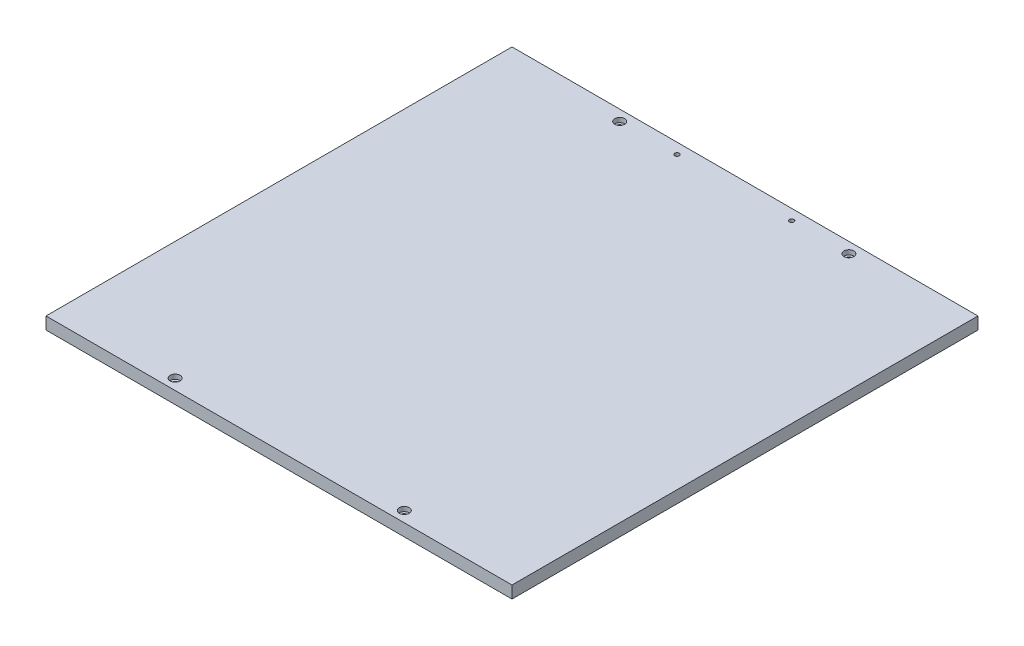
ISO-10303-21;
HEADER;
FILE_DESCRIPTION(('STEP AP214'),'2;1');
FILE_NAME('part.step','',(''),(''),'','','');
FILE_SCHEMA(('AUTOMOTIVE_DESIGN { 1 0 10303 214 1 1 1 1 }'));
ENDSEC;
DATA;
#1=APPLICATION_CONTEXT('core data for automotive mechanical design processes');
#2=APPLICATION_PROTOCOL_DEFINITION('international standard','automotive_design',2000,#1);
#3=PRODUCT_CONTEXT('',#1,'mechanical');
#4=PRODUCT('Part','Part','',(#3));
#5=PRODUCT_RELATED_PRODUCT_CATEGORY('part','',(#4));
#6=PRODUCT_DEFINITION_FORMATION('','',#4);
#7=PRODUCT_DEFINITION_CONTEXT('part definition',#1,'design');
#8=PRODUCT_DEFINITION('design','',#6,#7);
#9=PRODUCT_DEFINITION_SHAPE('','',#8);
#10=(LENGTH_UNIT() NAMED_UNIT(*) SI_UNIT(.MILLI.,.METRE.));
#11=(NAMED_UNIT(*) PLANE_ANGLE_UNIT() SI_UNIT($,.RADIAN.));
#12=(NAMED_UNIT(*) SI_UNIT($,.STERADIAN.) SOLID_ANGLE_UNIT());
#13=UNCERTAINTY_MEASURE_WITH_UNIT(LENGTH_MEASURE(1.E-05),#10,'distance_accuracy_value','');
#14=(GEOMETRIC_REPRESENTATION_CONTEXT(3) GLOBAL_UNCERTAINTY_ASSIGNED_CONTEXT((#13)) GLOBAL_UNIT_ASSIGNED_CONTEXT((#10,
#11,#12)) REPRESENTATION_CONTEXT('',''));
#15=CARTESIAN_POINT('',(0.,0.,0.));
#16=DIRECTION('',(0.,0.,1.));
#17=DIRECTION('',(1.,0.,0.));
#18=AXIS2_PLACEMENT_3D('',#15,#16,#17);
#19=CARTESIAN_POINT('',(152.5,8.,152.5));
#20=DIRECTION('',(-1.,0.,0.));
#21=DIRECTION('',(0.,0.,1.));
#22=AXIS2_PLACEMENT_3D('',#19,#20,#21);
#23=PLANE('',#22);
#24=DIRECTION('',(0.,0.,-1.));
#25=VECTOR('',#24,1.);
#26=CARTESIAN_POINT('',(152.5,0.,152.5));
#27=LINE('',#26,#25);
#28=CARTESIAN_POINT('',(152.5,0.,152.5));
#29=VERTEX_POINT('',#28);
#30=CARTESIAN_POINT('',(152.5,0.,-152.5));
#31=VERTEX_POINT('',#30);
#32=EDGE_CURVE('E111',#29,#31,#27,.T.);
#33=ORIENTED_EDGE('',*,*,#32,.T.);
#34=DIRECTION('',(0.,-1.,0.));
#35=VECTOR('',#34,1.);
#36=CARTESIAN_POINT('',(152.5,8.,-152.5));
#37=LINE('',#36,#35);
#38=CARTESIAN_POINT('',(152.5,8.,-152.5));
#39=VERTEX_POINT('',#38);
#40=EDGE_CURVE('E11',#39,#31,#37,.T.);
#41=ORIENTED_EDGE('',*,*,#40,.F.);
#42=DIRECTION('',(0.,0.,-1.));
#43=VECTOR('',#42,1.);
#44=CARTESIAN_POINT('',(152.5,8.,152.5));
#45=LINE('',#44,#43);
#46=CARTESIAN_POINT('',(152.5,8.,152.5));
#47=VERTEX_POINT('',#46);
#48=EDGE_CURVE('E95',#47,#39,#45,.T.);
#49=ORIENTED_EDGE('',*,*,#48,.F.);
#50=DIRECTION('',(0.,-1.,0.));
#51=VECTOR('',#50,1.);
#52=CARTESIAN_POINT('',(152.5,8.,152.5));
#53=LINE('',#52,#51);
#54=EDGE_CURVE('E107',#47,#29,#53,.T.);
#55=ORIENTED_EDGE('',*,*,#54,.T.);
#56=EDGE_LOOP('',(#33,#41,#49,#55));
#57=FACE_BOUND('',#56,.T.);
#58=ADVANCED_FACE('F43',(#57),#23,.F.);
#59=CARTESIAN_POINT('',(-152.5,8.,-152.5));
#60=DIRECTION('',(0.,0.,1.));
#61=DIRECTION('',(1.,0.,0.));
#62=AXIS2_PLACEMENT_3D('',#59,#60,#61);
#63=PLANE('',#62);
#64=DIRECTION('',(-1.,0.,0.));
#65=VECTOR('',#64,1.);
#66=CARTESIAN_POINT('',(-152.5,0.,-152.5));
#67=LINE('',#66,#65);
#68=CARTESIAN_POINT('',(-152.5,0.,-152.5));
#69=VERTEX_POINT('',#68);
#70=EDGE_CURVE('E100',#31,#69,#67,.T.);
#71=ORIENTED_EDGE('',*,*,#70,.T.);
#72=DIRECTION('',(0.,-1.,0.));
#73=VECTOR('',#72,1.);
#74=CARTESIAN_POINT('',(-152.5,8.,-152.5));
#75=LINE('',#74,#73);
#76=CARTESIAN_POINT('',(-152.5,8.,-152.5));
#77=VERTEX_POINT('',#76);
#78=EDGE_CURVE('E52',#77,#69,#75,.T.);
#79=ORIENTED_EDGE('',*,*,#78,.F.);
#80=DIRECTION('',(-1.,0.,0.));
#81=VECTOR('',#80,1.);
#82=CARTESIAN_POINT('',(-152.5,8.,-152.5));
#83=LINE('',#82,#81);
#84=EDGE_CURVE('E90',#39,#77,#83,.T.);
#85=ORIENTED_EDGE('',*,*,#84,.F.);
#86=ORIENTED_EDGE('',*,*,#40,.T.);
#87=EDGE_LOOP('',(#71,#79,#85,#86));
#88=FACE_BOUND('',#87,.T.);
#89=ADVANCED_FACE('F99',(#88),#63,.F.);
#90=CARTESIAN_POINT('',(-152.5,8.,152.5));
#91=DIRECTION('',(1.,0.,0.));
#92=DIRECTION('',(0.,0.,-1.));
#93=AXIS2_PLACEMENT_3D('',#90,#91,#92);
#94=PLANE('',#93);
#95=DIRECTION('',(0.,0.,1.));
#96=VECTOR('',#95,1.);
#97=CARTESIAN_POINT('',(-152.5,0.,152.5));
#98=LINE('',#97,#96);
#99=CARTESIAN_POINT('',(-152.5,0.,152.5));
#100=VERTEX_POINT('',#99);
#101=EDGE_CURVE('E77',#69,#100,#98,.T.);
#102=ORIENTED_EDGE('',*,*,#101,.T.);
#103=DIRECTION('',(0.,-1.,0.));
#104=VECTOR('',#103,1.);
#105=CARTESIAN_POINT('',(-152.5,8.,152.5));
#106=LINE('',#105,#104);
#107=CARTESIAN_POINT('',(-152.5,8.,152.5));
#108=VERTEX_POINT('',#107);
#109=EDGE_CURVE('E102',#108,#100,#106,.T.);
#110=ORIENTED_EDGE('',*,*,#109,.F.);
#111=DIRECTION('',(0.,0.,1.));
#112=VECTOR('',#111,1.);
#113=CARTESIAN_POINT('',(-152.5,8.,152.5));
#114=LINE('',#113,#112);
#115=EDGE_CURVE('E93',#77,#108,#114,.T.);
#116=ORIENTED_EDGE('',*,*,#115,.F.);
#117=ORIENTED_EDGE('',*,*,#78,.T.);
#118=EDGE_LOOP('',(#102,#110,#116,#117));
#119=FACE_BOUND('',#118,.T.);
#120=ADVANCED_FACE('F103',(#119),#94,.F.);
#121=CARTESIAN_POINT('',(-152.5,8.,152.5));
#122=DIRECTION('',(0.,0.,-1.));
#123=DIRECTION('',(-1.,0.,0.));
#124=AXIS2_PLACEMENT_3D('',#121,#122,#123);
#125=PLANE('',#124);
#126=DIRECTION('',(1.,0.,0.));
#127=VECTOR('',#126,1.);
#128=CARTESIAN_POINT('',(-152.5,0.,152.5));
#129=LINE('',#128,#127);
#130=EDGE_CURVE('E83',#100,#29,#129,.T.);
#131=ORIENTED_EDGE('',*,*,#130,.T.);
#132=ORIENTED_EDGE('',*,*,#54,.F.);
#133=DIRECTION('',(1.,0.,0.));
#134=VECTOR('',#133,1.);
#135=CARTESIAN_POINT('',(-152.5,8.,152.5));
#136=LINE('',#135,#134);
#137=EDGE_CURVE('E60',#108,#47,#136,.T.);
#138=ORIENTED_EDGE('',*,*,#137,.F.);
#139=ORIENTED_EDGE('',*,*,#109,.T.);
#140=EDGE_LOOP('',(#131,#132,#138,#139));
#141=FACE_BOUND('',#140,.T.);
#142=ADVANCED_FACE('F125',(#141),#125,.F.);
#143=CARTESIAN_POINT('',(0.,8.,0.));
#144=DIRECTION('',(0.,-1.,0.));
#145=DIRECTION('',(0.,0.,-1.));
#146=AXIS2_PLACEMENT_3D('',#143,#144,#145);
#147=PLANE('',#146);
#148=CARTESIAN_POINT('',(-37.5,8.,-145.5));
#149=DIRECTION('',(0.,1.,0.));
#150=DIRECTION('',(0.,0.,1.));
#151=AXIS2_PLACEMENT_3D('',#148,#149,#150);
#152=CIRCLE('',#151,1.5);
#153=CARTESIAN_POINT('',(-37.5,8.,-144.));
#154=VERTEX_POINT('',#153);
#155=EDGE_CURVE('E207',#154,#154,#152,.T.);
#156=ORIENTED_EDGE('',*,*,#155,.F.);
#157=EDGE_LOOP('',(#156));
#158=FACE_BOUND('',#157,.T.);
#159=CARTESIAN_POINT('',(37.5,8.,-145.5));
#160=DIRECTION('',(0.,1.,0.));
#161=DIRECTION('',(0.,0.,1.));
#162=AXIS2_PLACEMENT_3D('',#159,#160,#161);
#163=CIRCLE('',#162,1.5);
#164=CARTESIAN_POINT('',(37.5,8.,-144.));
#165=VERTEX_POINT('',#164);
#166=EDGE_CURVE('E199',#165,#165,#163,.T.);
#167=ORIENTED_EDGE('',*,*,#166,.F.);
#168=EDGE_LOOP('',(#167));
#169=FACE_BOUND('',#168,.T.);
#170=CARTESIAN_POINT('',(-75.,8.,-145.5));
#171=DIRECTION('',(0.,1.,0.));
#172=DIRECTION('',(0.,0.,1.));
#173=AXIS2_PLACEMENT_3D('',#170,#171,#172);
#174=CIRCLE('',#173,3.25);
#175=CARTESIAN_POINT('',(-75.,8.,-142.25));
#176=VERTEX_POINT('',#175);
#177=EDGE_CURVE('E191',#176,#176,#174,.T.);
#178=ORIENTED_EDGE('',*,*,#177,.F.);
#179=EDGE_LOOP('',(#178));
#180=FACE_BOUND('',#179,.T.);
#181=CARTESIAN_POINT('',(75.,8.,-145.5));
#182=DIRECTION('',(0.,1.,0.));
#183=DIRECTION('',(0.,0.,1.));
#184=AXIS2_PLACEMENT_3D('',#181,#182,#183);
#185=CIRCLE('',#184,3.25);
#186=CARTESIAN_POINT('',(75.,8.,-142.25));
#187=VERTEX_POINT('',#186);
#188=EDGE_CURVE('E175',#187,#187,#185,.T.);
#189=ORIENTED_EDGE('',*,*,#188,.F.);
#190=EDGE_LOOP('',(#189));
#191=FACE_BOUND('',#190,.T.);
#192=CARTESIAN_POINT('',(75.,8.,145.5));
#193=DIRECTION('',(0.,1.,0.));
#194=DIRECTION('',(0.,0.,1.));
#195=AXIS2_PLACEMENT_3D('',#192,#193,#194);
#196=CIRCLE('',#195,3.25);
#197=CARTESIAN_POINT('',(75.,8.,148.75));
#198=VERTEX_POINT('',#197);
#199=EDGE_CURVE('E159',#198,#198,#196,.T.);
#200=ORIENTED_EDGE('',*,*,#199,.F.);
#201=EDGE_LOOP('',(#200));
#202=FACE_BOUND('',#201,.T.);
#203=CARTESIAN_POINT('',(-75.,8.,145.5));
#204=DIRECTION('',(0.,1.,0.));
#205=DIRECTION('',(0.,0.,1.));
#206=AXIS2_PLACEMENT_3D('',#203,#204,#205);
#207=CIRCLE('',#206,3.25);
#208=CARTESIAN_POINT('',(-75.,8.,148.75));
#209=VERTEX_POINT('',#208);
#210=EDGE_CURVE('E143',#209,#209,#207,.T.);
#211=ORIENTED_EDGE('',*,*,#210,.F.);
#212=EDGE_LOOP('',(#211));
#213=FACE_BOUND('',#212,.T.);
#214=ORIENTED_EDGE('',*,*,#48,.T.);
#215=ORIENTED_EDGE('',*,*,#84,.T.);
#216=ORIENTED_EDGE('',*,*,#115,.T.);
#217=ORIENTED_EDGE('',*,*,#137,.T.);
#218=EDGE_LOOP('',(#214,#215,#216,#217));
#219=FACE_BOUND('',#218,.T.);
#220=ADVANCED_FACE('F91',(#158,#169,#180,#191,#202,#213,#219),#147,.F.);
#221=CARTESIAN_POINT('',(0.,0.,0.));
#222=DIRECTION('',(0.,-1.,0.));
#223=DIRECTION('',(0.,0.,-1.));
#224=AXIS2_PLACEMENT_3D('',#221,#222,#223);
#225=PLANE('',#224);
#226=CARTESIAN_POINT('',(-37.5,0.,-145.5));
#227=DIRECTION('',(0.,1.,0.));
#228=DIRECTION('',(0.,0.,1.));
#229=AXIS2_PLACEMENT_3D('',#226,#227,#228);
#230=CIRCLE('',#229,1.5);
#231=CARTESIAN_POINT('',(-37.5,0.,-144.));
#232=VERTEX_POINT('',#231);
#233=EDGE_CURVE('E203',#232,#232,#230,.T.);
#234=ORIENTED_EDGE('',*,*,#233,.T.);
#235=EDGE_LOOP('',(#234));
#236=FACE_BOUND('',#235,.T.);
#237=CARTESIAN_POINT('',(37.5,0.,-145.5));
#238=DIRECTION('',(0.,1.,0.));
#239=DIRECTION('',(0.,0.,1.));
#240=AXIS2_PLACEMENT_3D('',#237,#238,#239);
#241=CIRCLE('',#240,1.5);
#242=CARTESIAN_POINT('',(37.5,0.,-144.));
#243=VERTEX_POINT('',#242);
#244=EDGE_CURVE('E195',#243,#243,#241,.T.);
#245=ORIENTED_EDGE('',*,*,#244,.T.);
#246=EDGE_LOOP('',(#245));
#247=FACE_BOUND('',#246,.T.);
#248=CARTESIAN_POINT('',(-75.,0.,-145.5));
#249=DIRECTION('',(0.,1.,0.));
#250=DIRECTION('',(0.,0.,1.));
#251=AXIS2_PLACEMENT_3D('',#248,#249,#250);
#252=CIRCLE('',#251,1.69999999999999);
#253=CARTESIAN_POINT('',(-75.,0.,-143.8));
#254=VERTEX_POINT('',#253);
#255=EDGE_CURVE('E179',#254,#254,#252,.T.);
#256=ORIENTED_EDGE('',*,*,#255,.T.);
#257=EDGE_LOOP('',(#256));
#258=FACE_BOUND('',#257,.T.);
#259=CARTESIAN_POINT('',(75.,0.,-145.5));
#260=DIRECTION('',(0.,1.,0.));
#261=DIRECTION('',(0.,0.,1.));
#262=AXIS2_PLACEMENT_3D('',#259,#260,#261);
#263=CIRCLE('',#262,1.69999999999999);
#264=CARTESIAN_POINT('',(75.,0.,-143.8));
#265=VERTEX_POINT('',#264);
#266=EDGE_CURVE('E163',#265,#265,#263,.T.);
#267=ORIENTED_EDGE('',*,*,#266,.T.);
#268=EDGE_LOOP('',(#267));
#269=FACE_BOUND('',#268,.T.);
#270=CARTESIAN_POINT('',(75.,0.,145.5));
#271=DIRECTION('',(0.,1.,0.));
#272=DIRECTION('',(0.,0.,1.));
#273=AXIS2_PLACEMENT_3D('',#270,#271,#272);
#274=CIRCLE('',#273,1.69999999999999);
#275=CARTESIAN_POINT('',(75.,0.,147.2));
#276=VERTEX_POINT('',#275);
#277=EDGE_CURVE('E147',#276,#276,#274,.T.);
#278=ORIENTED_EDGE('',*,*,#277,.T.);
#279=EDGE_LOOP('',(#278));
#280=FACE_BOUND('',#279,.T.);
#281=CARTESIAN_POINT('',(-75.,0.,145.5));
#282=DIRECTION('',(0.,1.,0.));
#283=DIRECTION('',(0.,0.,1.));
#284=AXIS2_PLACEMENT_3D('',#281,#282,#283);
#285=CIRCLE('',#284,1.69999999999999);
#286=CARTESIAN_POINT('',(-75.,0.,147.2));
#287=VERTEX_POINT('',#286);
#288=EDGE_CURVE('E115',#287,#287,#285,.T.);
#289=ORIENTED_EDGE('',*,*,#288,.T.);
#290=EDGE_LOOP('',(#289));
#291=FACE_BOUND('',#290,.T.);
#292=ORIENTED_EDGE('',*,*,#32,.F.);
#293=ORIENTED_EDGE('',*,*,#130,.F.);
#294=ORIENTED_EDGE('',*,*,#101,.F.);
#295=ORIENTED_EDGE('',*,*,#70,.F.);
#296=EDGE_LOOP('',(#292,#293,#294,#295));
#297=FACE_BOUND('',#296,.T.);
#298=ADVANCED_FACE('F128',(#236,#247,#258,#269,#280,#291,#297),#225,.T.);
#299=CARTESIAN_POINT('',(-75.,8.,145.5));
#300=DIRECTION('',(0.,1.,0.));
#301=DIRECTION('',(0.,0.,1.));
#302=AXIS2_PLACEMENT_3D('',#299,#300,#301);
#303=CYLINDRICAL_SURFACE('',#302,1.69999999999999);
#304=ORIENTED_EDGE('',*,*,#288,.F.);
#305=EDGE_LOOP('',(#304));
#306=FACE_BOUND('',#305,.T.);
#307=CARTESIAN_POINT('',(-75.,5.,145.5));
#308=DIRECTION('',(0.,1.,0.));
#309=DIRECTION('',(0.,0.,1.));
#310=AXIS2_PLACEMENT_3D('',#307,#308,#309);
#311=CIRCLE('',#310,1.69999999999999);
#312=CARTESIAN_POINT('',(-75.,5.,147.2));
#313=VERTEX_POINT('',#312);
#314=EDGE_CURVE('E135',#313,#313,#311,.T.);
#315=ORIENTED_EDGE('',*,*,#314,.T.);
#316=EDGE_LOOP('',(#315));
#317=FACE_BOUND('',#316,.T.);
#318=ADVANCED_FACE('F240',(#306,#317),#303,.F.);
#319=CARTESIAN_POINT('',(-73.3,5.,145.5));
#320=DIRECTION('',(0.,-1.,0.));
#321=DIRECTION('',(0.,0.,-1.));
#322=AXIS2_PLACEMENT_3D('',#319,#320,#321);
#323=PLANE('',#322);
#324=ORIENTED_EDGE('',*,*,#314,.F.);
#325=EDGE_LOOP('',(#324));
#326=FACE_BOUND('',#325,.T.);
#327=CARTESIAN_POINT('',(-75.,5.,145.5));
#328=DIRECTION('',(0.,1.,0.));
#329=DIRECTION('',(0.,0.,1.));
#330=AXIS2_PLACEMENT_3D('',#327,#328,#329);
#331=CIRCLE('',#330,3.25);
#332=CARTESIAN_POINT('',(-75.,5.,148.75));
#333=VERTEX_POINT('',#332);
#334=EDGE_CURVE('E139',#333,#333,#331,.T.);
#335=ORIENTED_EDGE('',*,*,#334,.T.);
#336=EDGE_LOOP('',(#335));
#337=FACE_BOUND('',#336,.T.);
#338=ADVANCED_FACE('F230',(#326,#337),#323,.F.);
#339=CARTESIAN_POINT('',(-75.,8.,145.5));
#340=DIRECTION('',(0.,1.,0.));
#341=DIRECTION('',(0.,0.,1.));
#342=AXIS2_PLACEMENT_3D('',#339,#340,#341);
#343=CYLINDRICAL_SURFACE('',#342,3.25);
#344=ORIENTED_EDGE('',*,*,#334,.F.);
#345=EDGE_LOOP('',(#344));
#346=FACE_BOUND('',#345,.T.);
#347=ORIENTED_EDGE('',*,*,#210,.T.);
#348=EDGE_LOOP('',(#347));
#349=FACE_BOUND('',#348,.T.);
#350=ADVANCED_FACE('F227',(#346,#349),#343,.F.);
#351=CARTESIAN_POINT('',(75.,8.,145.5));
#352=DIRECTION('',(0.,1.,0.));
#353=DIRECTION('',(0.,0.,1.));
#354=AXIS2_PLACEMENT_3D('',#351,#352,#353);
#355=CYLINDRICAL_SURFACE('',#354,1.69999999999999);
#356=ORIENTED_EDGE('',*,*,#277,.F.);
#357=EDGE_LOOP('',(#356));
#358=FACE_BOUND('',#357,.T.);
#359=CARTESIAN_POINT('',(75.,5.,145.5));
#360=DIRECTION('',(0.,1.,0.));
#361=DIRECTION('',(0.,0.,1.));
#362=AXIS2_PLACEMENT_3D('',#359,#360,#361);
#363=CIRCLE('',#362,1.69999999999999);
#364=CARTESIAN_POINT('',(75.,5.,147.2));
#365=VERTEX_POINT('',#364);
#366=EDGE_CURVE('E151',#365,#365,#363,.T.);
#367=ORIENTED_EDGE('',*,*,#366,.T.);
#368=EDGE_LOOP('',(#367));
#369=FACE_BOUND('',#368,.T.);
#370=ADVANCED_FACE('F229',(#358,#369),#355,.F.);
#371=CARTESIAN_POINT('',(76.7,5.,145.5));
#372=DIRECTION('',(0.,-1.,0.));
#373=DIRECTION('',(0.,0.,-1.));
#374=AXIS2_PLACEMENT_3D('',#371,#372,#373);
#375=PLANE('',#374);
#376=ORIENTED_EDGE('',*,*,#366,.F.);
#377=EDGE_LOOP('',(#376));
#378=FACE_BOUND('',#377,.T.);
#379=CARTESIAN_POINT('',(75.,5.,145.5));
#380=DIRECTION('',(0.,1.,0.));
#381=DIRECTION('',(0.,0.,1.));
#382=AXIS2_PLACEMENT_3D('',#379,#380,#381);
#383=CIRCLE('',#382,3.25);
#384=CARTESIAN_POINT('',(75.,5.,148.75));
#385=VERTEX_POINT('',#384);
#386=EDGE_CURVE('E155',#385,#385,#383,.T.);
#387=ORIENTED_EDGE('',*,*,#386,.T.);
#388=EDGE_LOOP('',(#387));
#389=FACE_BOUND('',#388,.T.);
#390=ADVANCED_FACE('F237',(#378,#389),#375,.F.);
#391=CARTESIAN_POINT('',(75.,8.,145.5));
#392=DIRECTION('',(0.,1.,0.));
#393=DIRECTION('',(0.,0.,1.));
#394=AXIS2_PLACEMENT_3D('',#391,#392,#393);
#395=CYLINDRICAL_SURFACE('',#394,3.25);
#396=ORIENTED_EDGE('',*,*,#386,.F.);
#397=EDGE_LOOP('',(#396));
#398=FACE_BOUND('',#397,.T.);
#399=ORIENTED_EDGE('',*,*,#199,.T.);
#400=EDGE_LOOP('',(#399));
#401=FACE_BOUND('',#400,.T.);
#402=ADVANCED_FACE('F293',(#398,#401),#395,.F.);
#403=CARTESIAN_POINT('',(75.,8.,-145.5));
#404=DIRECTION('',(0.,1.,0.));
#405=DIRECTION('',(0.,0.,1.));
#406=AXIS2_PLACEMENT_3D('',#403,#404,#405);
#407=CYLINDRICAL_SURFACE('',#406,1.69999999999999);
#408=ORIENTED_EDGE('',*,*,#266,.F.);
#409=EDGE_LOOP('',(#408));
#410=FACE_BOUND('',#409,.T.);
#411=CARTESIAN_POINT('',(75.,5.,-145.5));
#412=DIRECTION('',(0.,1.,0.));
#413=DIRECTION('',(0.,0.,1.));
#414=AXIS2_PLACEMENT_3D('',#411,#412,#413);
#415=CIRCLE('',#414,1.69999999999999);
#416=CARTESIAN_POINT('',(75.,5.,-143.8));
#417=VERTEX_POINT('',#416);
#418=EDGE_CURVE('E167',#417,#417,#415,.T.);
#419=ORIENTED_EDGE('',*,*,#418,.T.);
#420=EDGE_LOOP('',(#419));
#421=FACE_BOUND('',#420,.T.);
#422=ADVANCED_FACE('F303',(#410,#421),#407,.F.);
#423=CARTESIAN_POINT('',(76.7,5.,-145.5));
#424=DIRECTION('',(0.,-1.,0.));
#425=DIRECTION('',(0.,0.,-1.));
#426=AXIS2_PLACEMENT_3D('',#423,#424,#425);
#427=PLANE('',#426);
#428=ORIENTED_EDGE('',*,*,#418,.F.);
#429=EDGE_LOOP('',(#428));
#430=FACE_BOUND('',#429,.T.);
#431=CARTESIAN_POINT('',(75.,5.,-145.5));
#432=DIRECTION('',(0.,1.,0.));
#433=DIRECTION('',(0.,0.,1.));
#434=AXIS2_PLACEMENT_3D('',#431,#432,#433);
#435=CIRCLE('',#434,3.25);
#436=CARTESIAN_POINT('',(75.,5.,-142.25));
#437=VERTEX_POINT('',#436);
#438=EDGE_CURVE('E171',#437,#437,#435,.T.);
#439=ORIENTED_EDGE('',*,*,#438,.T.);
#440=EDGE_LOOP('',(#439));
#441=FACE_BOUND('',#440,.T.);
#442=ADVANCED_FACE('F313',(#430,#441),#427,.F.);
#443=CARTESIAN_POINT('',(75.,8.,-145.5));
#444=DIRECTION('',(0.,1.,0.));
#445=DIRECTION('',(0.,0.,1.));
#446=AXIS2_PLACEMENT_3D('',#443,#444,#445);
#447=CYLINDRICAL_SURFACE('',#446,3.25);
#448=ORIENTED_EDGE('',*,*,#438,.F.);
#449=EDGE_LOOP('',(#448));
#450=FACE_BOUND('',#449,.T.);
#451=ORIENTED_EDGE('',*,*,#188,.T.);
#452=EDGE_LOOP('',(#451));
#453=FACE_BOUND('',#452,.T.);
#454=ADVANCED_FACE('F323',(#450,#453),#447,.F.);
#455=CARTESIAN_POINT('',(-75.,8.,-145.5));
#456=DIRECTION('',(0.,1.,0.));
#457=DIRECTION('',(0.,0.,1.));
#458=AXIS2_PLACEMENT_3D('',#455,#456,#457);
#459=CYLINDRICAL_SURFACE('',#458,1.69999999999999);
#460=ORIENTED_EDGE('',*,*,#255,.F.);
#461=EDGE_LOOP('',(#460));
#462=FACE_BOUND('',#461,.T.);
#463=CARTESIAN_POINT('',(-75.,5.,-145.5));
#464=DIRECTION('',(0.,1.,0.));
#465=DIRECTION('',(0.,0.,1.));
#466=AXIS2_PLACEMENT_3D('',#463,#464,#465);
#467=CIRCLE('',#466,1.69999999999999);
#468=CARTESIAN_POINT('',(-75.,5.,-143.8));
#469=VERTEX_POINT('',#468);
#470=EDGE_CURVE('E183',#469,#469,#467,.T.);
#471=ORIENTED_EDGE('',*,*,#470,.T.);
#472=EDGE_LOOP('',(#471));
#473=FACE_BOUND('',#472,.T.);
#474=ADVANCED_FACE('F333',(#462,#473),#459,.F.);
#475=CARTESIAN_POINT('',(-73.3,5.,-145.5));
#476=DIRECTION('',(0.,-1.,0.));
#477=DIRECTION('',(0.,0.,-1.));
#478=AXIS2_PLACEMENT_3D('',#475,#476,#477);
#479=PLANE('',#478);
#480=ORIENTED_EDGE('',*,*,#470,.F.);
#481=EDGE_LOOP('',(#480));
#482=FACE_BOUND('',#481,.T.);
#483=CARTESIAN_POINT('',(-75.,5.,-145.5));
#484=DIRECTION('',(0.,1.,0.));
#485=DIRECTION('',(0.,0.,1.));
#486=AXIS2_PLACEMENT_3D('',#483,#484,#485);
#487=CIRCLE('',#486,3.25);
#488=CARTESIAN_POINT('',(-75.,5.,-142.25));
#489=VERTEX_POINT('',#488);
#490=EDGE_CURVE('E187',#489,#489,#487,.T.);
#491=ORIENTED_EDGE('',*,*,#490,.T.);
#492=EDGE_LOOP('',(#491));
#493=FACE_BOUND('',#492,.T.);
#494=ADVANCED_FACE('F343',(#482,#493),#479,.F.);
#495=CARTESIAN_POINT('',(-75.,8.,-145.5));
#496=DIRECTION('',(0.,1.,0.));
#497=DIRECTION('',(0.,0.,1.));
#498=AXIS2_PLACEMENT_3D('',#495,#496,#497);
#499=CYLINDRICAL_SURFACE('',#498,3.25);
#500=ORIENTED_EDGE('',*,*,#490,.F.);
#501=EDGE_LOOP('',(#500));
#502=FACE_BOUND('',#501,.T.);
#503=ORIENTED_EDGE('',*,*,#177,.T.);
#504=EDGE_LOOP('',(#503));
#505=FACE_BOUND('',#504,.T.);
#506=ADVANCED_FACE('F353',(#502,#505),#499,.F.);
#507=CARTESIAN_POINT('',(37.5,8.,-145.5));
#508=DIRECTION('',(0.,1.,0.));
#509=DIRECTION('',(0.,0.,1.));
#510=AXIS2_PLACEMENT_3D('',#507,#508,#509);
#511=CYLINDRICAL_SURFACE('',#510,1.5);
#512=ORIENTED_EDGE('',*,*,#244,.F.);
#513=EDGE_LOOP('',(#512));
#514=FACE_BOUND('',#513,.T.);
#515=ORIENTED_EDGE('',*,*,#166,.T.);
#516=EDGE_LOOP('',(#515));
#517=FACE_BOUND('',#516,.T.);
#518=ADVANCED_FACE('F363',(#514,#517),#511,.F.);
#519=CARTESIAN_POINT('',(-37.5,8.,-145.5));
#520=DIRECTION('',(0.,1.,0.));
#521=DIRECTION('',(0.,0.,1.));
#522=AXIS2_PLACEMENT_3D('',#519,#520,#521);
#523=CYLINDRICAL_SURFACE('',#522,1.5);
#524=ORIENTED_EDGE('',*,*,#233,.F.);
#525=EDGE_LOOP('',(#524));
#526=FACE_BOUND('',#525,.T.);
#527=ORIENTED_EDGE('',*,*,#155,.T.);
#528=EDGE_LOOP('',(#527));
#529=FACE_BOUND('',#528,.T.);
#530=ADVANCED_FACE('F212',(#526,#529),#523,.F.);
#531=CLOSED_SHELL('',(#58,#89,#120,#142,#220,#298,#318,#338,#350,#370,#390,#402,#422,#442,#454,
#474,#494,#506,#518,#530));
#532=MANIFOLD_SOLID_BREP('B2',#531);
#533=ADVANCED_BREP_SHAPE_REPRESENTATION('',(#18,#532),#14);
#534=SHAPE_DEFINITION_REPRESENTATION(#9,#533);
ENDSEC;
END-ISO-10303-21;
